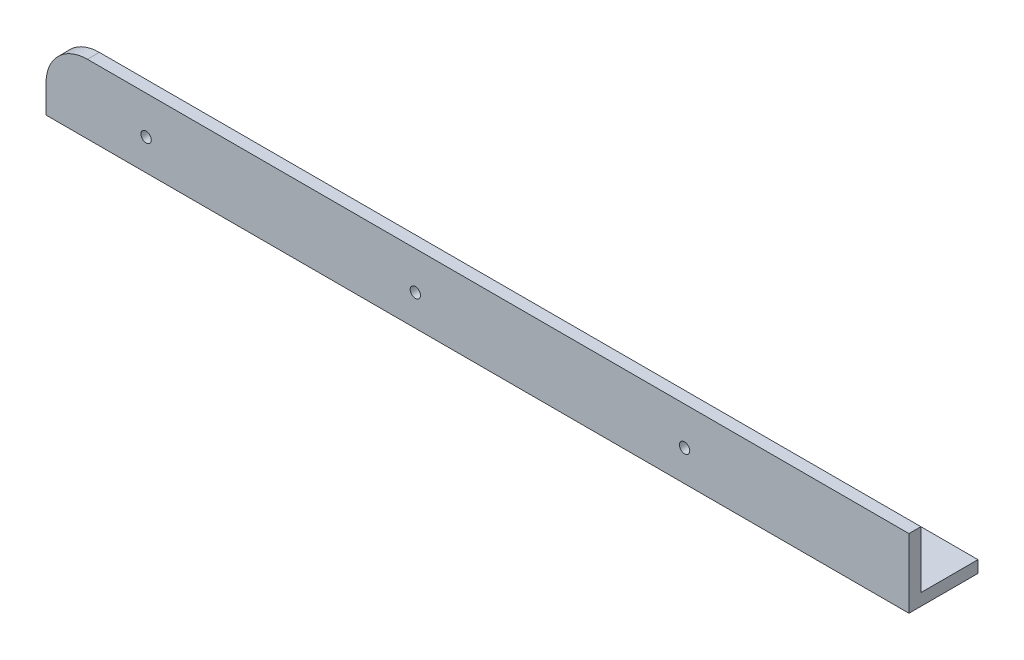
ISO-10303-21;
HEADER;
FILE_DESCRIPTION(('STEP AP214'),'2;1');
FILE_NAME('part.step','',(''),(''),'','','');
FILE_SCHEMA(('AUTOMOTIVE_DESIGN { 1 0 10303 214 1 1 1 1 }'));
ENDSEC;
DATA;
#1=APPLICATION_CONTEXT('core data for automotive mechanical design processes');
#2=APPLICATION_PROTOCOL_DEFINITION('international standard','automotive_design',2000,#1);
#3=PRODUCT_CONTEXT('',#1,'mechanical');
#4=PRODUCT('Part','Part','',(#3));
#5=PRODUCT_RELATED_PRODUCT_CATEGORY('part','',(#4));
#6=PRODUCT_DEFINITION_FORMATION('','',#4);
#7=PRODUCT_DEFINITION_CONTEXT('part definition',#1,'design');
#8=PRODUCT_DEFINITION('design','',#6,#7);
#9=PRODUCT_DEFINITION_SHAPE('','',#8);
#10=(LENGTH_UNIT() NAMED_UNIT(*) SI_UNIT(.MILLI.,.METRE.));
#11=(NAMED_UNIT(*) PLANE_ANGLE_UNIT() SI_UNIT($,.RADIAN.));
#12=(NAMED_UNIT(*) SI_UNIT($,.STERADIAN.) SOLID_ANGLE_UNIT());
#13=UNCERTAINTY_MEASURE_WITH_UNIT(LENGTH_MEASURE(1.E-05),#10,'distance_accuracy_value','');
#14=(GEOMETRIC_REPRESENTATION_CONTEXT(3) GLOBAL_UNCERTAINTY_ASSIGNED_CONTEXT((#13)) GLOBAL_UNIT_ASSIGNED_CONTEXT((#10,
#11,#12)) REPRESENTATION_CONTEXT('',''));
#15=CARTESIAN_POINT('',(0.,0.,0.));
#16=DIRECTION('',(0.,0.,1.));
#17=DIRECTION('',(1.,0.,0.));
#18=AXIS2_PLACEMENT_3D('',#15,#16,#17);
#19=CARTESIAN_POINT('',(250.,20.,-3.46117846701572));
#20=DIRECTION('',(0.,-1.,0.));
#21=DIRECTION('',(0.,0.,-1.));
#22=AXIS2_PLACEMENT_3D('',#19,#20,#21);
#23=PLANE('',#22);
#24=DIRECTION('',(0.,0.,1.));
#25=VECTOR('',#24,1.);
#26=CARTESIAN_POINT('',(12.,20.,-20.));
#27=LINE('',#26,#25);
#28=CARTESIAN_POINT('',(12.,20.,-3.46117846701573));
#29=VERTEX_POINT('',#28);
#30=CARTESIAN_POINT('',(12.,20.,0.));
#31=VERTEX_POINT('',#30);
#32=EDGE_CURVE('E369',#29,#31,#27,.T.);
#33=ORIENTED_EDGE('',*,*,#32,.T.);
#34=DIRECTION('',(-1.,0.,0.));
#35=VECTOR('',#34,1.);
#36=CARTESIAN_POINT('',(250.,20.,0.));
#37=LINE('',#36,#35);
#38=CARTESIAN_POINT('',(250.,20.,0.));
#39=VERTEX_POINT('',#38);
#40=EDGE_CURVE('E121',#39,#31,#37,.T.);
#41=ORIENTED_EDGE('',*,*,#40,.F.);
#42=DIRECTION('',(0.,0.,1.));
#43=VECTOR('',#42,1.);
#44=CARTESIAN_POINT('',(250.,20.,-3.46117846701572));
#45=LINE('',#44,#43);
#46=CARTESIAN_POINT('',(250.,20.,-3.46117846701572));
#47=VERTEX_POINT('',#46);
#48=EDGE_CURVE('E62',#47,#39,#45,.T.);
#49=ORIENTED_EDGE('',*,*,#48,.F.);
#50=DIRECTION('',(-1.,0.,0.));
#51=VECTOR('',#50,1.);
#52=CARTESIAN_POINT('',(250.,20.,-3.46117846701572));
#53=LINE('',#52,#51);
#54=EDGE_CURVE('E116',#47,#29,#53,.T.);
#55=ORIENTED_EDGE('',*,*,#54,.T.);
#56=EDGE_LOOP('',(#33,#41,#49,#55));
#57=FACE_BOUND('',#56,.T.);
#58=ADVANCED_FACE('F37',(#57),#23,.F.);
#59=CARTESIAN_POINT('',(250.,20.,0.));
#60=DIRECTION('',(0.,0.,-1.));
#61=DIRECTION('',(0.,1.,0.));
#62=AXIS2_PLACEMENT_3D('',#59,#60,#61);
#63=PLANE('',#62);
#64=CARTESIAN_POINT('',(29.0000000000002,9.00000000000001,0.));
#65=DIRECTION('',(0.,0.,1.));
#66=DIRECTION('',(1.,0.,0.));
#67=AXIS2_PLACEMENT_3D('',#64,#65,#66);
#68=CIRCLE('',#67,1.5);
#69=CARTESIAN_POINT('',(30.5000000000002,9.00000000000001,0.));
#70=VERTEX_POINT('',#69);
#71=EDGE_CURVE('E364',#70,#70,#68,.T.);
#72=ORIENTED_EDGE('',*,*,#71,.F.);
#73=EDGE_LOOP('',(#72));
#74=FACE_BOUND('',#73,.T.);
#75=CARTESIAN_POINT('',(107.,9.00000000000001,0.));
#76=DIRECTION('',(0.,0.,1.));
#77=DIRECTION('',(1.,0.,0.));
#78=AXIS2_PLACEMENT_3D('',#75,#76,#77);
#79=CIRCLE('',#78,1.5);
#80=CARTESIAN_POINT('',(108.5,9.00000000000001,0.));
#81=VERTEX_POINT('',#80);
#82=EDGE_CURVE('E366',#81,#81,#79,.T.);
#83=ORIENTED_EDGE('',*,*,#82,.F.);
#84=EDGE_LOOP('',(#83));
#85=FACE_BOUND('',#84,.T.);
#86=CARTESIAN_POINT('',(185.,9.00000000000002,0.));
#87=DIRECTION('',(0.,0.,1.));
#88=DIRECTION('',(1.,0.,0.));
#89=AXIS2_PLACEMENT_3D('',#86,#87,#88);
#90=CIRCLE('',#89,1.5);
#91=CARTESIAN_POINT('',(186.5,9.00000000000002,0.));
#92=VERTEX_POINT('',#91);
#93=EDGE_CURVE('E372',#92,#92,#90,.T.);
#94=ORIENTED_EDGE('',*,*,#93,.F.);
#95=EDGE_LOOP('',(#94));
#96=FACE_BOUND('',#95,.T.);
#97=ORIENTED_EDGE('',*,*,#40,.T.);
#98=CARTESIAN_POINT('',(12.,8.00000000000002,0.));
#99=DIRECTION('',(0.,0.,-1.));
#100=DIRECTION('',(1.,0.,0.));
#101=AXIS2_PLACEMENT_3D('',#98,#99,#100);
#102=CIRCLE('',#101,12.);
#103=CARTESIAN_POINT('',(0.,8.00000000000001,0.));
#104=VERTEX_POINT('',#103);
#105=EDGE_CURVE('E365',#104,#31,#102,.T.);
#106=ORIENTED_EDGE('',*,*,#105,.F.);
#107=DIRECTION('',(0.,-1.,0.));
#108=VECTOR('',#107,1.);
#109=CARTESIAN_POINT('',(0.,20.,0.));
#110=LINE('',#109,#108);
#111=CARTESIAN_POINT('',(0.,0.,0.));
#112=VERTEX_POINT('',#111);
#113=EDGE_CURVE('E75',#104,#112,#110,.T.);
#114=ORIENTED_EDGE('',*,*,#113,.T.);
#115=DIRECTION('',(-1.,0.,0.));
#116=VECTOR('',#115,1.);
#117=CARTESIAN_POINT('',(250.,0.,0.));
#118=LINE('',#117,#116);
#119=CARTESIAN_POINT('',(250.,0.,0.));
#120=VERTEX_POINT('',#119);
#121=EDGE_CURVE('E46',#120,#112,#118,.T.);
#122=ORIENTED_EDGE('',*,*,#121,.F.);
#123=DIRECTION('',(0.,-1.,0.));
#124=VECTOR('',#123,1.);
#125=CARTESIAN_POINT('',(250.,20.,0.));
#126=LINE('',#125,#124);
#127=EDGE_CURVE('E126',#39,#120,#126,.T.);
#128=ORIENTED_EDGE('',*,*,#127,.F.);
#129=EDGE_LOOP('',(#97,#106,#114,#122,#128));
#130=FACE_BOUND('',#129,.T.);
#131=ADVANCED_FACE('F39',(#74,#85,#96,#130),#63,.F.);
#132=CARTESIAN_POINT('',(250.,0.,0.));
#133=DIRECTION('',(0.,1.,0.));
#134=DIRECTION('',(0.,0.,1.));
#135=AXIS2_PLACEMENT_3D('',#132,#133,#134);
#136=PLANE('',#135);
#137=CARTESIAN_POINT('',(130.,0.,-10.));
#138=DIRECTION('',(0.,-1.,0.));
#139=DIRECTION('',(0.,0.,-1.));
#140=AXIS2_PLACEMENT_3D('',#137,#138,#139);
#141=CIRCLE('',#140,1.5);
#142=CARTESIAN_POINT('',(130.,0.,-11.5));
#143=VERTEX_POINT('',#142);
#144=EDGE_CURVE('E161',#143,#143,#141,.T.);
#145=ORIENTED_EDGE('',*,*,#144,.F.);
#146=EDGE_LOOP('',(#145));
#147=FACE_BOUND('',#146,.T.);
#148=CARTESIAN_POINT('',(34.,0.,-10.));
#149=DIRECTION('',(0.,-1.,0.));
#150=DIRECTION('',(0.,0.,-1.));
#151=AXIS2_PLACEMENT_3D('',#148,#149,#150);
#152=CIRCLE('',#151,1.5);
#153=CARTESIAN_POINT('',(34.,0.,-11.5));
#154=VERTEX_POINT('',#153);
#155=EDGE_CURVE('E156',#154,#154,#152,.T.);
#156=ORIENTED_EDGE('',*,*,#155,.F.);
#157=EDGE_LOOP('',(#156));
#158=FACE_BOUND('',#157,.T.);
#159=CARTESIAN_POINT('',(226.,0.,-10.));
#160=DIRECTION('',(0.,-1.,0.));
#161=DIRECTION('',(0.,0.,-1.));
#162=AXIS2_PLACEMENT_3D('',#159,#160,#161);
#163=CIRCLE('',#162,1.5);
#164=CARTESIAN_POINT('',(226.,0.,-11.5));
#165=VERTEX_POINT('',#164);
#166=EDGE_CURVE('E152',#165,#165,#163,.T.);
#167=ORIENTED_EDGE('',*,*,#166,.F.);
#168=EDGE_LOOP('',(#167));
#169=FACE_BOUND('',#168,.T.);
#170=ORIENTED_EDGE('',*,*,#121,.T.);
#171=DIRECTION('',(-0.707106781186556,0.,0.707106781186539));
#172=VECTOR('',#171,1.);
#173=CARTESIAN_POINT('',(0.,0.,0.));
#174=LINE('',#173,#172);
#175=CARTESIAN_POINT('',(20.0000000000005,0.,-20.));
#176=VERTEX_POINT('',#175);
#177=EDGE_CURVE('E175',#176,#112,#174,.T.);
#178=ORIENTED_EDGE('',*,*,#177,.F.);
#179=DIRECTION('',(-1.,0.,0.));
#180=VECTOR('',#179,1.);
#181=CARTESIAN_POINT('',(250.,0.,-20.));
#182=LINE('',#181,#180);
#183=CARTESIAN_POINT('',(250.,0.,-20.));
#184=VERTEX_POINT('',#183);
#185=EDGE_CURVE('E132',#184,#176,#182,.T.);
#186=ORIENTED_EDGE('',*,*,#185,.F.);
#187=DIRECTION('',(0.,0.,-1.));
#188=VECTOR('',#187,1.);
#189=CARTESIAN_POINT('',(250.,0.,0.));
#190=LINE('',#189,#188);
#191=EDGE_CURVE('E169',#120,#184,#190,.T.);
#192=ORIENTED_EDGE('',*,*,#191,.F.);
#193=EDGE_LOOP('',(#170,#178,#186,#192));
#194=FACE_BOUND('',#193,.T.);
#195=ADVANCED_FACE('F174',(#147,#158,#169,#194),#136,.F.);
#196=CARTESIAN_POINT('',(250.,0.,-20.));
#197=DIRECTION('',(0.,0.,1.));
#198=DIRECTION('',(1.,0.,0.));
#199=AXIS2_PLACEMENT_3D('',#196,#197,#198);
#200=PLANE('',#199);
#201=ORIENTED_EDGE('',*,*,#185,.T.);
#202=DIRECTION('',(0.,-1.,0.));
#203=VECTOR('',#202,1.);
#204=CARTESIAN_POINT('',(20.0000000000005,20.,-20.));
#205=LINE('',#204,#203);
#206=CARTESIAN_POINT('',(20.0000000000005,3.46117846701572,-20.));
#207=VERTEX_POINT('',#206);
#208=EDGE_CURVE('E166',#207,#176,#205,.T.);
#209=ORIENTED_EDGE('',*,*,#208,.F.);
#210=DIRECTION('',(-1.,0.,0.));
#211=VECTOR('',#210,1.);
#212=CARTESIAN_POINT('',(250.,3.46117846701572,-20.));
#213=LINE('',#212,#211);
#214=CARTESIAN_POINT('',(250.,3.46117846701572,-20.));
#215=VERTEX_POINT('',#214);
#216=EDGE_CURVE('E115',#215,#207,#213,.T.);
#217=ORIENTED_EDGE('',*,*,#216,.F.);
#218=DIRECTION('',(0.,1.,0.));
#219=VECTOR('',#218,1.);
#220=CARTESIAN_POINT('',(250.,0.,-20.));
#221=LINE('',#220,#219);
#222=EDGE_CURVE('E105',#184,#215,#221,.T.);
#223=ORIENTED_EDGE('',*,*,#222,.F.);
#224=EDGE_LOOP('',(#201,#209,#217,#223));
#225=FACE_BOUND('',#224,.T.);
#226=ADVANCED_FACE('F178',(#225),#200,.F.);
#227=CARTESIAN_POINT('',(250.,3.46117846701572,-20.));
#228=DIRECTION('',(0.,-1.,0.));
#229=DIRECTION('',(0.,0.,-1.));
#230=AXIS2_PLACEMENT_3D('',#227,#228,#229);
#231=PLANE('',#230);
#232=CARTESIAN_POINT('',(130.,3.46117846701572,-10.));
#233=DIRECTION('',(0.,-1.,0.));
#234=DIRECTION('',(0.,0.,-1.));
#235=AXIS2_PLACEMENT_3D('',#232,#233,#234);
#236=CIRCLE('',#235,1.5);
#237=CARTESIAN_POINT('',(130.,3.46117846701572,-11.5));
#238=VERTEX_POINT('',#237);
#239=EDGE_CURVE('E127',#238,#238,#236,.T.);
#240=ORIENTED_EDGE('',*,*,#239,.T.);
#241=EDGE_LOOP('',(#240));
#242=FACE_BOUND('',#241,.T.);
#243=CARTESIAN_POINT('',(34.,3.46117846701572,-10.));
#244=DIRECTION('',(0.,-1.,0.));
#245=DIRECTION('',(0.,0.,-1.));
#246=AXIS2_PLACEMENT_3D('',#243,#244,#245);
#247=CIRCLE('',#246,1.5);
#248=CARTESIAN_POINT('',(34.,3.46117846701572,-11.5));
#249=VERTEX_POINT('',#248);
#250=EDGE_CURVE('E140',#249,#249,#247,.T.);
#251=ORIENTED_EDGE('',*,*,#250,.T.);
#252=EDGE_LOOP('',(#251));
#253=FACE_BOUND('',#252,.T.);
#254=CARTESIAN_POINT('',(226.,3.46117846701572,-10.));
#255=DIRECTION('',(0.,-1.,0.));
#256=DIRECTION('',(0.,0.,-1.));
#257=AXIS2_PLACEMENT_3D('',#254,#255,#256);
#258=CIRCLE('',#257,1.5);
#259=CARTESIAN_POINT('',(226.,3.46117846701572,-11.5));
#260=VERTEX_POINT('',#259);
#261=EDGE_CURVE('E137',#260,#260,#258,.T.);
#262=ORIENTED_EDGE('',*,*,#261,.T.);
#263=EDGE_LOOP('',(#262));
#264=FACE_BOUND('',#263,.T.);
#265=ORIENTED_EDGE('',*,*,#216,.T.);
#266=DIRECTION('',(-0.707106781186556,0.,0.707106781186539));
#267=VECTOR('',#266,1.);
#268=CARTESIAN_POINT('',(135.000000000003,3.46117846701573,-135.));
#269=LINE('',#268,#267);
#270=CARTESIAN_POINT('',(3.46117846701582,3.46117846701572,-3.46117846701572));
#271=VERTEX_POINT('',#270);
#272=EDGE_CURVE('E113',#207,#271,#269,.T.);
#273=ORIENTED_EDGE('',*,*,#272,.T.);
#274=DIRECTION('',(-1.,0.,0.));
#275=VECTOR('',#274,1.);
#276=CARTESIAN_POINT('',(250.,3.46117846701572,-3.46117846701572));
#277=LINE('',#276,#275);
#278=CARTESIAN_POINT('',(250.,3.46117846701572,-3.46117846701572));
#279=VERTEX_POINT('',#278);
#280=EDGE_CURVE('E111',#279,#271,#277,.T.);
#281=ORIENTED_EDGE('',*,*,#280,.F.);
#282=DIRECTION('',(0.,0.,1.));
#283=VECTOR('',#282,1.);
#284=CARTESIAN_POINT('',(250.,3.46117846701572,-20.));
#285=LINE('',#284,#283);
#286=EDGE_CURVE('E98',#215,#279,#285,.T.);
#287=ORIENTED_EDGE('',*,*,#286,.F.);
#288=EDGE_LOOP('',(#265,#273,#281,#287));
#289=FACE_BOUND('',#288,.T.);
#290=ADVANCED_FACE('F112',(#242,#253,#264,#289),#231,.F.);
#291=CARTESIAN_POINT('',(250.,3.46117846701572,-3.46117846701572));
#292=DIRECTION('',(0.,0.,1.));
#293=DIRECTION('',(1.,0.,0.));
#294=AXIS2_PLACEMENT_3D('',#291,#292,#293);
#295=PLANE('',#294);
#296=CARTESIAN_POINT('',(29.0000000000002,9.00000000000001,-3.46117846701572));
#297=DIRECTION('',(0.,0.,1.));
#298=DIRECTION('',(1.,0.,0.));
#299=AXIS2_PLACEMENT_3D('',#296,#297,#298);
#300=CIRCLE('',#299,1.5);
#301=CARTESIAN_POINT('',(30.5000000000002,9.00000000000001,-3.46117846701572));
#302=VERTEX_POINT('',#301);
#303=EDGE_CURVE('E41',#302,#302,#300,.T.);
#304=ORIENTED_EDGE('',*,*,#303,.T.);
#305=EDGE_LOOP('',(#304));
#306=FACE_BOUND('',#305,.T.);
#307=CARTESIAN_POINT('',(107.,9.00000000000001,-3.46117846701572));
#308=DIRECTION('',(0.,0.,1.));
#309=DIRECTION('',(1.,0.,0.));
#310=AXIS2_PLACEMENT_3D('',#307,#308,#309);
#311=CIRCLE('',#310,1.5);
#312=CARTESIAN_POINT('',(108.5,9.00000000000001,-3.46117846701572));
#313=VERTEX_POINT('',#312);
#314=EDGE_CURVE('E147',#313,#313,#311,.T.);
#315=ORIENTED_EDGE('',*,*,#314,.T.);
#316=EDGE_LOOP('',(#315));
#317=FACE_BOUND('',#316,.T.);
#318=CARTESIAN_POINT('',(185.,9.00000000000002,-3.46117846701572));
#319=DIRECTION('',(0.,0.,1.));
#320=DIRECTION('',(1.,0.,0.));
#321=AXIS2_PLACEMENT_3D('',#318,#319,#320);
#322=CIRCLE('',#321,1.5);
#323=CARTESIAN_POINT('',(186.5,9.00000000000002,-3.46117846701572));
#324=VERTEX_POINT('',#323);
#325=EDGE_CURVE('E145',#324,#324,#322,.T.);
#326=ORIENTED_EDGE('',*,*,#325,.T.);
#327=EDGE_LOOP('',(#326));
#328=FACE_BOUND('',#327,.T.);
#329=DIRECTION('',(0.,1.,0.));
#330=VECTOR('',#329,1.);
#331=CARTESIAN_POINT('',(3.46117846701582,3.46117846701572,-3.46117846701572));
#332=LINE('',#331,#330);
#333=CARTESIAN_POINT('',(3.46117846701582,16.4314012375077,-3.46117846701572));
#334=VERTEX_POINT('',#333);
#335=EDGE_CURVE('E86',#271,#334,#332,.T.);
#336=ORIENTED_EDGE('',*,*,#335,.T.);
#337=CARTESIAN_POINT('',(12.,8.00000000000002,-3.46117846701572));
#338=DIRECTION('',(0.,0.,1.));
#339=DIRECTION('',(1.,0.,0.));
#340=AXIS2_PLACEMENT_3D('',#337,#338,#339);
#341=CIRCLE('',#340,12.);
#342=EDGE_CURVE('E54',#334,#29,#341,.F.);
#343=ORIENTED_EDGE('',*,*,#342,.T.);
#344=ORIENTED_EDGE('',*,*,#54,.F.);
#345=DIRECTION('',(0.,1.,0.));
#346=VECTOR('',#345,1.);
#347=CARTESIAN_POINT('',(250.,3.46117846701572,-3.46117846701572));
#348=LINE('',#347,#346);
#349=EDGE_CURVE('E102',#279,#47,#348,.T.);
#350=ORIENTED_EDGE('',*,*,#349,.F.);
#351=ORIENTED_EDGE('',*,*,#280,.T.);
#352=EDGE_LOOP('',(#336,#343,#344,#350,#351));
#353=FACE_BOUND('',#352,.T.);
#354=ADVANCED_FACE('F118',(#306,#317,#328,#353),#295,.F.);
#355=CARTESIAN_POINT('',(250.,0.,0.));
#356=DIRECTION('',(1.,0.,0.));
#357=DIRECTION('',(0.,0.,-1.));
#358=AXIS2_PLACEMENT_3D('',#355,#356,#357);
#359=PLANE('',#358);
#360=ORIENTED_EDGE('',*,*,#127,.T.);
#361=ORIENTED_EDGE('',*,*,#191,.T.);
#362=ORIENTED_EDGE('',*,*,#222,.T.);
#363=ORIENTED_EDGE('',*,*,#286,.T.);
#364=ORIENTED_EDGE('',*,*,#349,.T.);
#365=ORIENTED_EDGE('',*,*,#48,.T.);
#366=EDGE_LOOP('',(#360,#361,#362,#363,#364,#365));
#367=FACE_BOUND('',#366,.T.);
#368=ADVANCED_FACE('F100',(#367),#359,.T.);
#369=CARTESIAN_POINT('',(0.,20.,0.));
#370=DIRECTION('',(0.707106781186539,0.,0.707106781186556));
#371=DIRECTION('',(0.707106781186556,0.,-0.707106781186539));
#372=AXIS2_PLACEMENT_3D('',#369,#370,#371);
#373=PLANE('',#372);
#374=ORIENTED_EDGE('',*,*,#113,.F.);
#375=CARTESIAN_POINT('',(12.,8.00000000000002,-11.9999999999997));
#376=DIRECTION('',(0.707106781186539,0.,0.707106781186556));
#377=DIRECTION('',(-0.707106781186556,0.,0.707106781186539));
#378=AXIS2_PLACEMENT_3D('',#375,#376,#377);
#379=ELLIPSE('',#378,16.9705627484769,12.);
#380=EDGE_CURVE('E11',#104,#334,#379,.F.);
#381=ORIENTED_EDGE('',*,*,#380,.T.);
#382=ORIENTED_EDGE('',*,*,#335,.F.);
#383=ORIENTED_EDGE('',*,*,#272,.F.);
#384=ORIENTED_EDGE('',*,*,#208,.T.);
#385=ORIENTED_EDGE('',*,*,#177,.T.);
#386=EDGE_LOOP('',(#374,#381,#382,#383,#384,#385));
#387=FACE_BOUND('',#386,.T.);
#388=ADVANCED_FACE('F208',(#387),#373,.F.);
#389=CARTESIAN_POINT('',(226.,20.,-10.));
#390=DIRECTION('',(0.,-1.,0.));
#391=DIRECTION('',(0.,0.,-1.));
#392=AXIS2_PLACEMENT_3D('',#389,#390,#391);
#393=CYLINDRICAL_SURFACE('',#392,1.5);
#394=ORIENTED_EDGE('',*,*,#166,.T.);
#395=EDGE_LOOP('',(#394));
#396=FACE_BOUND('',#395,.T.);
#397=ORIENTED_EDGE('',*,*,#261,.F.);
#398=EDGE_LOOP('',(#397));
#399=FACE_BOUND('',#398,.T.);
#400=ADVANCED_FACE('F197',(#396,#399),#393,.F.);
#401=CARTESIAN_POINT('',(34.,20.,-10.));
#402=DIRECTION('',(0.,-1.,0.));
#403=DIRECTION('',(0.,0.,-1.));
#404=AXIS2_PLACEMENT_3D('',#401,#402,#403);
#405=CYLINDRICAL_SURFACE('',#404,1.5);
#406=ORIENTED_EDGE('',*,*,#155,.T.);
#407=EDGE_LOOP('',(#406));
#408=FACE_BOUND('',#407,.T.);
#409=ORIENTED_EDGE('',*,*,#250,.F.);
#410=EDGE_LOOP('',(#409));
#411=FACE_BOUND('',#410,.T.);
#412=ADVANCED_FACE('F194',(#408,#411),#405,.F.);
#413=CARTESIAN_POINT('',(130.,20.,-10.));
#414=DIRECTION('',(0.,-1.,0.));
#415=DIRECTION('',(0.,0.,-1.));
#416=AXIS2_PLACEMENT_3D('',#413,#414,#415);
#417=CYLINDRICAL_SURFACE('',#416,1.5);
#418=ORIENTED_EDGE('',*,*,#144,.T.);
#419=EDGE_LOOP('',(#418));
#420=FACE_BOUND('',#419,.T.);
#421=ORIENTED_EDGE('',*,*,#239,.F.);
#422=EDGE_LOOP('',(#421));
#423=FACE_BOUND('',#422,.T.);
#424=ADVANCED_FACE('F186',(#420,#423),#417,.F.);
#425=CARTESIAN_POINT('',(12.,8.00000000000002,-20.));
#426=DIRECTION('',(0.,0.,1.));
#427=DIRECTION('',(1.,0.,0.));
#428=AXIS2_PLACEMENT_3D('',#425,#426,#427);
#429=CYLINDRICAL_SURFACE('',#428,12.);
#430=ORIENTED_EDGE('',*,*,#380,.F.);
#431=ORIENTED_EDGE('',*,*,#105,.T.);
#432=ORIENTED_EDGE('',*,*,#32,.F.);
#433=ORIENTED_EDGE('',*,*,#342,.F.);
#434=EDGE_LOOP('',(#430,#431,#432,#433));
#435=FACE_BOUND('',#434,.T.);
#436=ADVANCED_FACE('F256',(#435),#429,.T.);
#437=CARTESIAN_POINT('',(185.,9.00000000000002,-20.));
#438=DIRECTION('',(0.,0.,1.));
#439=DIRECTION('',(1.,0.,0.));
#440=AXIS2_PLACEMENT_3D('',#437,#438,#439);
#441=CYLINDRICAL_SURFACE('',#440,1.5);
#442=CARTESIAN_POINT('',(186.5,9.00000000000002,0.));
#443=CARTESIAN_POINT('',(186.5,9.00000000000002,-0.0360539423647476));
#444=CARTESIAN_POINT('',(186.5,9.00000000000002,-0.0721078847294952));
#445=CARTESIAN_POINT('',(186.5,9.00000000000002,-0.144215769458989));
#446=CARTESIAN_POINT('',(186.5,9.00000000000002,-0.180269711823736));
#447=CARTESIAN_POINT('',(186.5,9.00000000000002,-0.25237759655323));
#448=CARTESIAN_POINT('',(186.5,9.00000000000002,-0.288431538917977));
#449=CARTESIAN_POINT('',(186.5,9.00000000000002,-0.360539423647471));
#450=CARTESIAN_POINT('',(186.5,9.00000000000002,-0.396593366012218));
#451=CARTESIAN_POINT('',(186.5,9.00000000000002,-0.468701250741712));
#452=CARTESIAN_POINT('',(186.5,9.00000000000002,-0.504755193106459));
#453=CARTESIAN_POINT('',(186.5,9.00000000000002,-0.576863077835953));
#454=CARTESIAN_POINT('',(186.5,9.00000000000002,-0.6129170202007));
#455=CARTESIAN_POINT('',(186.5,9.00000000000002,-0.685024904930194));
#456=CARTESIAN_POINT('',(186.5,9.00000000000002,-0.721078847294941));
#457=CARTESIAN_POINT('',(186.5,9.00000000000002,-0.793186732024435));
#458=CARTESIAN_POINT('',(186.5,9.00000000000002,-0.829240674389182));
#459=CARTESIAN_POINT('',(186.5,9.00000000000002,-0.901348559118676));
#460=CARTESIAN_POINT('',(186.5,9.00000000000002,-0.937402501483423));
#461=CARTESIAN_POINT('',(186.5,9.00000000000002,-1.00951038621292));
#462=CARTESIAN_POINT('',(186.5,9.00000000000002,-1.04556432857767));
#463=CARTESIAN_POINT('',(186.5,9.00000000000002,-1.11767221330716));
#464=CARTESIAN_POINT('',(186.5,9.00000000000002,-1.15372615567191));
#465=CARTESIAN_POINT('',(186.5,9.00000000000002,-1.2258340404014));
#466=CARTESIAN_POINT('',(186.5,9.00000000000002,-1.26188798276615));
#467=CARTESIAN_POINT('',(186.5,9.00000000000002,-1.33399586749564));
#468=CARTESIAN_POINT('',(186.5,9.00000000000002,-1.37004980986039));
#469=CARTESIAN_POINT('',(186.5,9.00000000000002,-1.44215769458988));
#470=CARTESIAN_POINT('',(186.5,9.00000000000002,-1.47821163695463));
#471=CARTESIAN_POINT('',(186.5,9.00000000000002,-1.55031952168412));
#472=CARTESIAN_POINT('',(186.5,9.00000000000002,-1.58637346404887));
#473=CARTESIAN_POINT('',(186.5,9.00000000000002,-1.65848134877836));
#474=CARTESIAN_POINT('',(186.5,9.00000000000002,-1.69453529114311));
#475=CARTESIAN_POINT('',(186.5,9.00000000000002,-1.76664317587261));
#476=CARTESIAN_POINT('',(186.5,9.00000000000002,-1.80269711823736));
#477=CARTESIAN_POINT('',(186.5,9.00000000000002,-1.87480500296685));
#478=CARTESIAN_POINT('',(186.5,9.00000000000002,-1.9108589453316));
#479=CARTESIAN_POINT('',(186.5,9.00000000000002,-1.98296683006109));
#480=CARTESIAN_POINT('',(186.5,9.00000000000002,-2.01902077242584));
#481=CARTESIAN_POINT('',(186.5,9.00000000000002,-2.09112865715533));
#482=CARTESIAN_POINT('',(186.5,9.00000000000002,-2.12718259952008));
#483=CARTESIAN_POINT('',(186.5,9.00000000000002,-2.19929048424957));
#484=CARTESIAN_POINT('',(186.5,9.00000000000002,-2.23534442661432));
#485=CARTESIAN_POINT('',(186.5,9.00000000000002,-2.30745231134381));
#486=CARTESIAN_POINT('',(186.5,9.00000000000002,-2.34350625370856));
#487=CARTESIAN_POINT('',(186.5,9.00000000000002,-2.41561413843805));
#488=CARTESIAN_POINT('',(186.5,9.00000000000002,-2.4516680808028));
#489=CARTESIAN_POINT('',(186.5,9.00000000000002,-2.5237759655323));
#490=CARTESIAN_POINT('',(186.5,9.00000000000002,-2.55982990789704));
#491=CARTESIAN_POINT('',(186.5,9.00000000000002,-2.63193779262654));
#492=CARTESIAN_POINT('',(186.5,9.00000000000002,-2.66799173499128));
#493=CARTESIAN_POINT('',(186.5,9.00000000000002,-2.74009961972078));
#494=CARTESIAN_POINT('',(186.5,9.00000000000002,-2.77615356208553));
#495=CARTESIAN_POINT('',(186.5,9.00000000000002,-2.84826144681502));
#496=CARTESIAN_POINT('',(186.5,9.00000000000002,-2.88431538917977));
#497=CARTESIAN_POINT('',(186.5,9.00000000000002,-2.95642327390926));
#498=CARTESIAN_POINT('',(186.5,9.00000000000002,-2.99247721627401));
#499=CARTESIAN_POINT('',(186.5,9.00000000000002,-3.0645851010035));
#500=CARTESIAN_POINT('',(186.5,9.00000000000002,-3.10063904336825));
#501=CARTESIAN_POINT('',(186.5,9.00000000000002,-3.17274692809774));
#502=CARTESIAN_POINT('',(186.5,9.00000000000002,-3.20880087046249));
#503=CARTESIAN_POINT('',(186.5,9.00000000000002,-3.28090875519198));
#504=CARTESIAN_POINT('',(186.5,9.00000000000002,-3.31696269755673));
#505=CARTESIAN_POINT('',(186.5,9.00000000000002,-3.38907058228622));
#506=CARTESIAN_POINT('',(186.5,9.00000000000002,-3.42512452465097));
#507=CARTESIAN_POINT('',(186.5,9.00000000000002,-3.46117846701572));
#508=B_SPLINE_CURVE_WITH_KNOTS('',3,(#442,#443,#444,#445,#446,#447,#448,#449,#450,#451,#452,
#453,#454,#455,#456,#457,#458,#459,#460,#461,#462,#463,#464,#465,#466,#467,#468,#469,#470,#471,
#472,#473,#474,#475,#476,#477,#478,#479,#480,#481,#482,#483,#484,#485,#486,#487,#488,#489,#490,
#491,#492,#493,#494,#495,#496,#497,#498,#499,#500,#501,#502,#503,#504,#505,#506,#507),
.UNSPECIFIED.,.F.,.F.,(4,2,2,2,2,2,2,2,2,2,2,2,2,2,2,2,2,2,2,2,2,2,2,2,2,2,2,2,2,2,2,2,4),(0.,
0.108161827094243,0.216323654188482,0.324485481282725,0.432647308376964,0.540809135471207,
0.648970962565446,0.757132789659689,0.865294616753928,0.973456443848171,1.08161827094241,
1.18978009803665,1.2979419251309,1.40610375222514,1.51426557931938,1.62242740641362,
1.73058923350786,1.8387510606021,1.94691288769634,2.05507471479058,2.16323654188482,
2.27139836897907,2.37956019607331,2.48772202316755,2.59588385026179,2.70404567735603,
2.81220750445027,2.92036933154451,3.02853115863876,3.136692985733,3.24485481282724,
3.35301663992148,3.46117846701572),.UNSPECIFIED.);
#509=EDGE_CURVE('BSEAM261',#92,#324,#508,.T.);
#510=ORIENTED_EDGE('',*,*,#93,.T.);
#511=ORIENTED_EDGE('',*,*,#325,.F.);
#512=ORIENTED_EDGE('',*,*,#509,.T.);
#513=ORIENTED_EDGE('',*,*,#509,.F.);
#514=EDGE_LOOP('',(#510,#512,#511,#513));
#515=FACE_BOUND('',#514,.T.);
#516=ADVANCED_FACE('F261',(#515),#441,.F.);
#517=CARTESIAN_POINT('',(107.,9.00000000000001,-20.));
#518=DIRECTION('',(0.,0.,1.));
#519=DIRECTION('',(1.,0.,0.));
#520=AXIS2_PLACEMENT_3D('',#517,#518,#519);
#521=CYLINDRICAL_SURFACE('',#520,1.5);
#522=CARTESIAN_POINT('',(108.5,9.00000000000001,0.));
#523=CARTESIAN_POINT('',(108.5,9.00000000000001,-0.0360539423647476));
#524=CARTESIAN_POINT('',(108.5,9.00000000000001,-0.0721078847294952));
#525=CARTESIAN_POINT('',(108.5,9.00000000000001,-0.144215769458989));
#526=CARTESIAN_POINT('',(108.5,9.00000000000001,-0.180269711823736));
#527=CARTESIAN_POINT('',(108.5,9.00000000000001,-0.25237759655323));
#528=CARTESIAN_POINT('',(108.5,9.00000000000001,-0.288431538917977));
#529=CARTESIAN_POINT('',(108.5,9.00000000000001,-0.360539423647471));
#530=CARTESIAN_POINT('',(108.5,9.00000000000001,-0.396593366012218));
#531=CARTESIAN_POINT('',(108.5,9.00000000000001,-0.468701250741712));
#532=CARTESIAN_POINT('',(108.5,9.00000000000001,-0.504755193106459));
#533=CARTESIAN_POINT('',(108.5,9.00000000000001,-0.576863077835953));
#534=CARTESIAN_POINT('',(108.5,9.00000000000001,-0.6129170202007));
#535=CARTESIAN_POINT('',(108.5,9.00000000000001,-0.685024904930194));
#536=CARTESIAN_POINT('',(108.5,9.00000000000001,-0.721078847294941));
#537=CARTESIAN_POINT('',(108.5,9.00000000000001,-0.793186732024435));
#538=CARTESIAN_POINT('',(108.5,9.00000000000001,-0.829240674389182));
#539=CARTESIAN_POINT('',(108.5,9.00000000000001,-0.901348559118676));
#540=CARTESIAN_POINT('',(108.5,9.00000000000001,-0.937402501483423));
#541=CARTESIAN_POINT('',(108.5,9.00000000000001,-1.00951038621292));
#542=CARTESIAN_POINT('',(108.5,9.00000000000001,-1.04556432857767));
#543=CARTESIAN_POINT('',(108.5,9.00000000000001,-1.11767221330716));
#544=CARTESIAN_POINT('',(108.5,9.00000000000001,-1.15372615567191));
#545=CARTESIAN_POINT('',(108.5,9.00000000000001,-1.2258340404014));
#546=CARTESIAN_POINT('',(108.5,9.00000000000001,-1.26188798276615));
#547=CARTESIAN_POINT('',(108.5,9.00000000000001,-1.33399586749564));
#548=CARTESIAN_POINT('',(108.5,9.00000000000001,-1.37004980986039));
#549=CARTESIAN_POINT('',(108.5,9.00000000000001,-1.44215769458988));
#550=CARTESIAN_POINT('',(108.5,9.00000000000001,-1.47821163695463));
#551=CARTESIAN_POINT('',(108.5,9.00000000000001,-1.55031952168412));
#552=CARTESIAN_POINT('',(108.5,9.00000000000001,-1.58637346404887));
#553=CARTESIAN_POINT('',(108.5,9.00000000000001,-1.65848134877836));
#554=CARTESIAN_POINT('',(108.5,9.00000000000001,-1.69453529114311));
#555=CARTESIAN_POINT('',(108.5,9.00000000000001,-1.76664317587261));
#556=CARTESIAN_POINT('',(108.5,9.00000000000001,-1.80269711823736));
#557=CARTESIAN_POINT('',(108.5,9.00000000000001,-1.87480500296685));
#558=CARTESIAN_POINT('',(108.5,9.00000000000001,-1.9108589453316));
#559=CARTESIAN_POINT('',(108.5,9.00000000000001,-1.98296683006109));
#560=CARTESIAN_POINT('',(108.5,9.00000000000001,-2.01902077242584));
#561=CARTESIAN_POINT('',(108.5,9.00000000000001,-2.09112865715533));
#562=CARTESIAN_POINT('',(108.5,9.00000000000001,-2.12718259952008));
#563=CARTESIAN_POINT('',(108.5,9.00000000000001,-2.19929048424957));
#564=CARTESIAN_POINT('',(108.5,9.00000000000001,-2.23534442661432));
#565=CARTESIAN_POINT('',(108.5,9.00000000000001,-2.30745231134381));
#566=CARTESIAN_POINT('',(108.5,9.00000000000001,-2.34350625370856));
#567=CARTESIAN_POINT('',(108.5,9.00000000000001,-2.41561413843805));
#568=CARTESIAN_POINT('',(108.5,9.00000000000001,-2.4516680808028));
#569=CARTESIAN_POINT('',(108.5,9.00000000000001,-2.5237759655323));
#570=CARTESIAN_POINT('',(108.5,9.00000000000001,-2.55982990789704));
#571=CARTESIAN_POINT('',(108.5,9.00000000000001,-2.63193779262654));
#572=CARTESIAN_POINT('',(108.5,9.00000000000001,-2.66799173499128));
#573=CARTESIAN_POINT('',(108.5,9.00000000000001,-2.74009961972078));
#574=CARTESIAN_POINT('',(108.5,9.00000000000001,-2.77615356208553));
#575=CARTESIAN_POINT('',(108.5,9.00000000000001,-2.84826144681502));
#576=CARTESIAN_POINT('',(108.5,9.00000000000001,-2.88431538917977));
#577=CARTESIAN_POINT('',(108.5,9.00000000000001,-2.95642327390926));
#578=CARTESIAN_POINT('',(108.5,9.00000000000001,-2.99247721627401));
#579=CARTESIAN_POINT('',(108.5,9.00000000000001,-3.0645851010035));
#580=CARTESIAN_POINT('',(108.5,9.00000000000001,-3.10063904336825));
#581=CARTESIAN_POINT('',(108.5,9.00000000000001,-3.17274692809774));
#582=CARTESIAN_POINT('',(108.5,9.00000000000001,-3.20880087046249));
#583=CARTESIAN_POINT('',(108.5,9.00000000000001,-3.28090875519198));
#584=CARTESIAN_POINT('',(108.5,9.00000000000001,-3.31696269755673));
#585=CARTESIAN_POINT('',(108.5,9.00000000000001,-3.38907058228622));
#586=CARTESIAN_POINT('',(108.5,9.00000000000001,-3.42512452465097));
#587=CARTESIAN_POINT('',(108.5,9.00000000000001,-3.46117846701572));
#588=B_SPLINE_CURVE_WITH_KNOTS('',3,(#522,#523,#524,#525,#526,#527,#528,#529,#530,#531,#532,
#533,#534,#535,#536,#537,#538,#539,#540,#541,#542,#543,#544,#545,#546,#547,#548,#549,#550,#551,
#552,#553,#554,#555,#556,#557,#558,#559,#560,#561,#562,#563,#564,#565,#566,#567,#568,#569,#570,
#571,#572,#573,#574,#575,#576,#577,#578,#579,#580,#581,#582,#583,#584,#585,#586,#587),
.UNSPECIFIED.,.F.,.F.,(4,2,2,2,2,2,2,2,2,2,2,2,2,2,2,2,2,2,2,2,2,2,2,2,2,2,2,2,2,2,2,2,4),(0.,
0.108161827094243,0.216323654188482,0.324485481282725,0.432647308376964,0.540809135471207,
0.648970962565446,0.757132789659689,0.865294616753928,0.973456443848171,1.08161827094241,
1.18978009803665,1.2979419251309,1.40610375222514,1.51426557931938,1.62242740641362,
1.73058923350786,1.8387510606021,1.94691288769634,2.05507471479058,2.16323654188482,
2.27139836897907,2.37956019607331,2.48772202316755,2.59588385026179,2.70404567735603,
2.81220750445027,2.92036933154451,3.02853115863876,3.136692985733,3.24485481282724,
3.35301663992148,3.46117846701572),.UNSPECIFIED.);
#589=EDGE_CURVE('BSEAM273',#81,#313,#588,.T.);
#590=ORIENTED_EDGE('',*,*,#82,.T.);
#591=ORIENTED_EDGE('',*,*,#314,.F.);
#592=ORIENTED_EDGE('',*,*,#589,.T.);
#593=ORIENTED_EDGE('',*,*,#589,.F.);
#594=EDGE_LOOP('',(#590,#592,#591,#593));
#595=FACE_BOUND('',#594,.T.);
#596=ADVANCED_FACE('F273',(#595),#521,.F.);
#597=CARTESIAN_POINT('',(29.0000000000002,9.00000000000001,-20.));
#598=DIRECTION('',(0.,0.,1.));
#599=DIRECTION('',(1.,0.,0.));
#600=AXIS2_PLACEMENT_3D('',#597,#598,#599);
#601=CYLINDRICAL_SURFACE('',#600,1.5);
#602=CARTESIAN_POINT('',(30.5000000000002,9.00000000000001,0.));
#603=CARTESIAN_POINT('',(30.5000000000002,9.00000000000001,-0.0360539423647476));
#604=CARTESIAN_POINT('',(30.5000000000002,9.00000000000001,-0.0721078847294952));
#605=CARTESIAN_POINT('',(30.5000000000002,9.00000000000001,-0.144215769458989));
#606=CARTESIAN_POINT('',(30.5000000000002,9.00000000000001,-0.180269711823736));
#607=CARTESIAN_POINT('',(30.5000000000002,9.00000000000001,-0.25237759655323));
#608=CARTESIAN_POINT('',(30.5000000000002,9.00000000000001,-0.288431538917977));
#609=CARTESIAN_POINT('',(30.5000000000002,9.00000000000001,-0.360539423647471));
#610=CARTESIAN_POINT('',(30.5000000000002,9.00000000000001,-0.396593366012218));
#611=CARTESIAN_POINT('',(30.5000000000002,9.00000000000001,-0.468701250741712));
#612=CARTESIAN_POINT('',(30.5000000000002,9.00000000000001,-0.504755193106459));
#613=CARTESIAN_POINT('',(30.5000000000002,9.00000000000001,-0.576863077835953));
#614=CARTESIAN_POINT('',(30.5000000000002,9.00000000000001,-0.6129170202007));
#615=CARTESIAN_POINT('',(30.5000000000002,9.00000000000001,-0.685024904930194));
#616=CARTESIAN_POINT('',(30.5000000000002,9.00000000000001,-0.721078847294941));
#617=CARTESIAN_POINT('',(30.5000000000002,9.00000000000001,-0.793186732024435));
#618=CARTESIAN_POINT('',(30.5000000000002,9.00000000000001,-0.829240674389182));
#619=CARTESIAN_POINT('',(30.5000000000002,9.00000000000001,-0.901348559118676));
#620=CARTESIAN_POINT('',(30.5000000000002,9.00000000000001,-0.937402501483423));
#621=CARTESIAN_POINT('',(30.5000000000002,9.00000000000001,-1.00951038621292));
#622=CARTESIAN_POINT('',(30.5000000000002,9.00000000000001,-1.04556432857767));
#623=CARTESIAN_POINT('',(30.5000000000002,9.00000000000001,-1.11767221330716));
#624=CARTESIAN_POINT('',(30.5000000000002,9.00000000000001,-1.15372615567191));
#625=CARTESIAN_POINT('',(30.5000000000002,9.00000000000001,-1.2258340404014));
#626=CARTESIAN_POINT('',(30.5000000000002,9.00000000000001,-1.26188798276615));
#627=CARTESIAN_POINT('',(30.5000000000002,9.00000000000001,-1.33399586749564));
#628=CARTESIAN_POINT('',(30.5000000000002,9.00000000000001,-1.37004980986039));
#629=CARTESIAN_POINT('',(30.5000000000002,9.00000000000001,-1.44215769458988));
#630=CARTESIAN_POINT('',(30.5000000000002,9.00000000000001,-1.47821163695463));
#631=CARTESIAN_POINT('',(30.5000000000002,9.00000000000001,-1.55031952168412));
#632=CARTESIAN_POINT('',(30.5000000000002,9.00000000000001,-1.58637346404887));
#633=CARTESIAN_POINT('',(30.5000000000002,9.00000000000001,-1.65848134877836));
#634=CARTESIAN_POINT('',(30.5000000000002,9.00000000000001,-1.69453529114311));
#635=CARTESIAN_POINT('',(30.5000000000002,9.00000000000001,-1.76664317587261));
#636=CARTESIAN_POINT('',(30.5000000000002,9.00000000000001,-1.80269711823736));
#637=CARTESIAN_POINT('',(30.5000000000002,9.00000000000001,-1.87480500296685));
#638=CARTESIAN_POINT('',(30.5000000000002,9.00000000000001,-1.9108589453316));
#639=CARTESIAN_POINT('',(30.5000000000002,9.00000000000001,-1.98296683006109));
#640=CARTESIAN_POINT('',(30.5000000000002,9.00000000000001,-2.01902077242584));
#641=CARTESIAN_POINT('',(30.5000000000002,9.00000000000001,-2.09112865715533));
#642=CARTESIAN_POINT('',(30.5000000000002,9.00000000000001,-2.12718259952008));
#643=CARTESIAN_POINT('',(30.5000000000002,9.00000000000001,-2.19929048424957));
#644=CARTESIAN_POINT('',(30.5000000000002,9.00000000000001,-2.23534442661432));
#645=CARTESIAN_POINT('',(30.5000000000002,9.00000000000001,-2.30745231134381));
#646=CARTESIAN_POINT('',(30.5000000000002,9.00000000000001,-2.34350625370856));
#647=CARTESIAN_POINT('',(30.5000000000002,9.00000000000001,-2.41561413843805));
#648=CARTESIAN_POINT('',(30.5000000000002,9.00000000000001,-2.4516680808028));
#649=CARTESIAN_POINT('',(30.5000000000002,9.00000000000001,-2.5237759655323));
#650=CARTESIAN_POINT('',(30.5000000000002,9.00000000000001,-2.55982990789704));
#651=CARTESIAN_POINT('',(30.5000000000002,9.00000000000001,-2.63193779262654));
#652=CARTESIAN_POINT('',(30.5000000000002,9.00000000000001,-2.66799173499128));
#653=CARTESIAN_POINT('',(30.5000000000002,9.00000000000001,-2.74009961972078));
#654=CARTESIAN_POINT('',(30.5000000000002,9.00000000000001,-2.77615356208553));
#655=CARTESIAN_POINT('',(30.5000000000002,9.00000000000001,-2.84826144681502));
#656=CARTESIAN_POINT('',(30.5000000000002,9.00000000000001,-2.88431538917977));
#657=CARTESIAN_POINT('',(30.5000000000002,9.00000000000001,-2.95642327390926));
#658=CARTESIAN_POINT('',(30.5000000000002,9.00000000000001,-2.99247721627401));
#659=CARTESIAN_POINT('',(30.5000000000002,9.00000000000001,-3.0645851010035));
#660=CARTESIAN_POINT('',(30.5000000000002,9.00000000000001,-3.10063904336825));
#661=CARTESIAN_POINT('',(30.5000000000002,9.00000000000001,-3.17274692809774));
#662=CARTESIAN_POINT('',(30.5000000000002,9.00000000000001,-3.20880087046249));
#663=CARTESIAN_POINT('',(30.5000000000002,9.00000000000001,-3.28090875519198));
#664=CARTESIAN_POINT('',(30.5000000000002,9.00000000000001,-3.31696269755673));
#665=CARTESIAN_POINT('',(30.5000000000002,9.00000000000001,-3.38907058228622));
#666=CARTESIAN_POINT('',(30.5000000000002,9.00000000000001,-3.42512452465097));
#667=CARTESIAN_POINT('',(30.5000000000002,9.00000000000001,-3.46117846701572));
#668=B_SPLINE_CURVE_WITH_KNOTS('',3,(#602,#603,#604,#605,#606,#607,#608,#609,#610,#611,#612,
#613,#614,#615,#616,#617,#618,#619,#620,#621,#622,#623,#624,#625,#626,#627,#628,#629,#630,#631,
#632,#633,#634,#635,#636,#637,#638,#639,#640,#641,#642,#643,#644,#645,#646,#647,#648,#649,#650,
#651,#652,#653,#654,#655,#656,#657,#658,#659,#660,#661,#662,#663,#664,#665,#666,#667),
.UNSPECIFIED.,.F.,.F.,(4,2,2,2,2,2,2,2,2,2,2,2,2,2,2,2,2,2,2,2,2,2,2,2,2,2,2,2,2,2,2,2,4),(0.,
0.108161827094243,0.216323654188482,0.324485481282725,0.432647308376964,0.540809135471207,
0.648970962565446,0.757132789659689,0.865294616753928,0.973456443848171,1.08161827094241,
1.18978009803665,1.2979419251309,1.40610375222514,1.51426557931938,1.62242740641362,
1.73058923350786,1.8387510606021,1.94691288769634,2.05507471479058,2.16323654188482,
2.27139836897907,2.37956019607331,2.48772202316755,2.59588385026179,2.70404567735603,
2.81220750445027,2.92036933154451,3.02853115863876,3.136692985733,3.24485481282724,
3.35301663992148,3.46117846701572),.UNSPECIFIED.);
#669=EDGE_CURVE('BSEAM284',#70,#302,#668,.T.);
#670=ORIENTED_EDGE('',*,*,#71,.T.);
#671=ORIENTED_EDGE('',*,*,#303,.F.);
#672=ORIENTED_EDGE('',*,*,#669,.T.);
#673=ORIENTED_EDGE('',*,*,#669,.F.);
#674=EDGE_LOOP('',(#670,#672,#671,#673));
#675=FACE_BOUND('',#674,.T.);
#676=ADVANCED_FACE('F284',(#675),#601,.F.);
#677=CLOSED_SHELL('',(#58,#131,#195,#226,#290,#354,#368,#388,#400,#412,#424,#436,#516,#596,#676));
#678=MANIFOLD_SOLID_BREP('B2',#677);
#679=ADVANCED_BREP_SHAPE_REPRESENTATION('',(#18,#678),#14);
#680=SHAPE_DEFINITION_REPRESENTATION(#9,#679);
ENDSEC;
END-ISO-10303-21;
